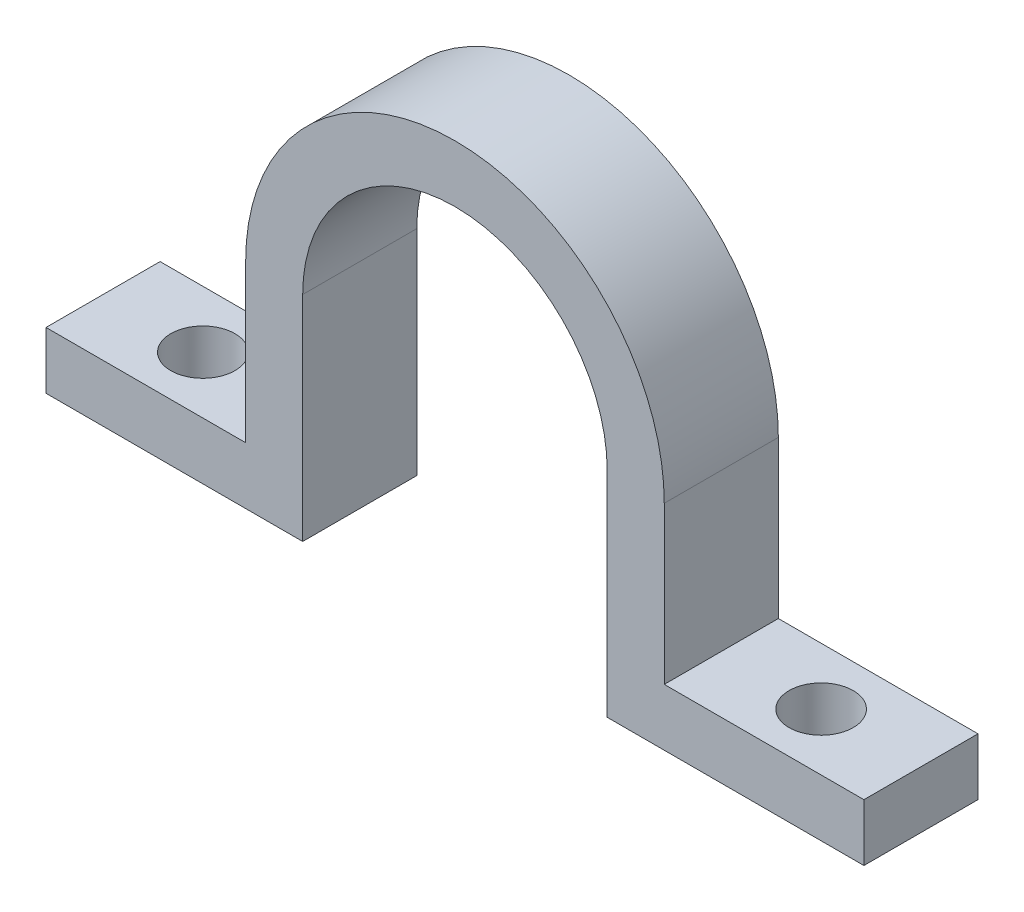
ISO-10303-21;
HEADER;
FILE_DESCRIPTION(('STEP AP214'),'2;1');
FILE_NAME('part.step','',(''),(''),'','','');
FILE_SCHEMA(('AUTOMOTIVE_DESIGN { 1 0 10303 214 1 1 1 1 }'));
ENDSEC;
DATA;
#1=APPLICATION_CONTEXT('core data for automotive mechanical design processes');
#2=APPLICATION_PROTOCOL_DEFINITION('international standard','automotive_design',2000,#1);
#3=PRODUCT_CONTEXT('',#1,'mechanical');
#4=PRODUCT('Part','Part','',(#3));
#5=PRODUCT_RELATED_PRODUCT_CATEGORY('part','',(#4));
#6=PRODUCT_DEFINITION_FORMATION('','',#4);
#7=PRODUCT_DEFINITION_CONTEXT('part definition',#1,'design');
#8=PRODUCT_DEFINITION('design','',#6,#7);
#9=PRODUCT_DEFINITION_SHAPE('','',#8);
#10=(LENGTH_UNIT() NAMED_UNIT(*) SI_UNIT(.MILLI.,.METRE.));
#11=(NAMED_UNIT(*) PLANE_ANGLE_UNIT() SI_UNIT($,.RADIAN.));
#12=(NAMED_UNIT(*) SI_UNIT($,.STERADIAN.) SOLID_ANGLE_UNIT());
#13=UNCERTAINTY_MEASURE_WITH_UNIT(LENGTH_MEASURE(1.E-05),#10,'distance_accuracy_value','');
#14=(GEOMETRIC_REPRESENTATION_CONTEXT(3) GLOBAL_UNCERTAINTY_ASSIGNED_CONTEXT((#13)) GLOBAL_UNIT_ASSIGNED_CONTEXT((#10,
#11,#12)) REPRESENTATION_CONTEXT('',''));
#15=CARTESIAN_POINT('',(0.,0.,0.));
#16=DIRECTION('',(0.,0.,1.));
#17=DIRECTION('',(1.,0.,0.));
#18=AXIS2_PLACEMENT_3D('',#15,#16,#17);
#19=CARTESIAN_POINT('',(-28.6775,4.,4.));
#20=DIRECTION('',(1.,0.,0.));
#21=DIRECTION('',(0.,0.,-1.));
#22=AXIS2_PLACEMENT_3D('',#19,#20,#21);
#23=PLANE('',#22);
#24=DIRECTION('',(0.,-1.,0.));
#25=VECTOR('',#24,1.);
#26=CARTESIAN_POINT('',(-28.6775,4.,-4.));
#27=LINE('',#26,#25);
#28=CARTESIAN_POINT('',(-28.6775,4.,-4.));
#29=VERTEX_POINT('',#28);
#30=CARTESIAN_POINT('',(-28.6775,0.,-4.));
#31=VERTEX_POINT('',#30);
#32=EDGE_CURVE('E164',#29,#31,#27,.T.);
#33=ORIENTED_EDGE('',*,*,#32,.T.);
#34=DIRECTION('',(0.,0.,-1.));
#35=VECTOR('',#34,1.);
#36=CARTESIAN_POINT('',(-28.6775,0.,4.));
#37=LINE('',#36,#35);
#38=CARTESIAN_POINT('',(-28.6775,0.,4.));
#39=VERTEX_POINT('',#38);
#40=EDGE_CURVE('E11',#39,#31,#37,.T.);
#41=ORIENTED_EDGE('',*,*,#40,.F.);
#42=DIRECTION('',(0.,-1.,0.));
#43=VECTOR('',#42,1.);
#44=CARTESIAN_POINT('',(-28.6775,4.,4.));
#45=LINE('',#44,#43);
#46=CARTESIAN_POINT('',(-28.6775,4.,4.));
#47=VERTEX_POINT('',#46);
#48=EDGE_CURVE('E189',#47,#39,#45,.T.);
#49=ORIENTED_EDGE('',*,*,#48,.F.);
#50=DIRECTION('',(0.,0.,-1.));
#51=VECTOR('',#50,1.);
#52=CARTESIAN_POINT('',(-28.6775,4.,4.));
#53=LINE('',#52,#51);
#54=EDGE_CURVE('E161',#47,#29,#53,.T.);
#55=ORIENTED_EDGE('',*,*,#54,.T.);
#56=EDGE_LOOP('',(#33,#41,#49,#55));
#57=FACE_BOUND('',#56,.T.);
#58=ADVANCED_FACE('F43',(#57),#23,.F.);
#59=CARTESIAN_POINT('',(-28.6775,0.,4.));
#60=DIRECTION('',(0.,1.,0.));
#61=DIRECTION('',(0.,0.,1.));
#62=AXIS2_PLACEMENT_3D('',#59,#60,#61);
#63=PLANE('',#62);
#64=CARTESIAN_POINT('',(-21.6775,0.,0.));
#65=DIRECTION('',(0.,1.,0.));
#66=DIRECTION('',(0.,0.,1.));
#67=AXIS2_PLACEMENT_3D('',#64,#65,#66);
#68=CIRCLE('',#67,2.25);
#69=CARTESIAN_POINT('',(-21.6775,0.,2.25));
#70=VERTEX_POINT('',#69);
#71=EDGE_CURVE('E213',#70,#70,#68,.F.);
#72=ORIENTED_EDGE('',*,*,#71,.F.);
#73=EDGE_LOOP('',(#72));
#74=FACE_BOUND('',#73,.T.);
#75=DIRECTION('',(1.,0.,0.));
#76=VECTOR('',#75,1.);
#77=CARTESIAN_POINT('',(-28.6775,0.,-4.));
#78=LINE('',#77,#76);
#79=CARTESIAN_POINT('',(-10.6775,0.,-4.));
#80=VERTEX_POINT('',#79);
#81=EDGE_CURVE('E169',#31,#80,#78,.T.);
#82=ORIENTED_EDGE('',*,*,#81,.T.);
#83=DIRECTION('',(0.,0.,-1.));
#84=VECTOR('',#83,1.);
#85=CARTESIAN_POINT('',(-10.6775,0.,4.));
#86=LINE('',#85,#84);
#87=CARTESIAN_POINT('',(-10.6775,0.,4.));
#88=VERTEX_POINT('',#87);
#89=EDGE_CURVE('E55',#88,#80,#86,.T.);
#90=ORIENTED_EDGE('',*,*,#89,.F.);
#91=DIRECTION('',(1.,0.,0.));
#92=VECTOR('',#91,1.);
#93=CARTESIAN_POINT('',(-28.6775,0.,4.));
#94=LINE('',#93,#92);
#95=EDGE_CURVE('E116',#39,#88,#94,.T.);
#96=ORIENTED_EDGE('',*,*,#95,.F.);
#97=ORIENTED_EDGE('',*,*,#40,.T.);
#98=EDGE_LOOP('',(#82,#90,#96,#97));
#99=FACE_BOUND('',#98,.T.);
#100=ADVANCED_FACE('F268',(#74,#99),#63,.F.);
#101=CARTESIAN_POINT('',(-10.6775,0.,4.));
#102=DIRECTION('',(-1.,0.,0.));
#103=DIRECTION('',(0.,0.,1.));
#104=AXIS2_PLACEMENT_3D('',#101,#102,#103);
#105=PLANE('',#104);
#106=DIRECTION('',(0.,1.,0.));
#107=VECTOR('',#106,1.);
#108=CARTESIAN_POINT('',(-10.6775,0.,-4.));
#109=LINE('',#108,#107);
#110=CARTESIAN_POINT('',(-10.6775,15.,-4.));
#111=VERTEX_POINT('',#110);
#112=EDGE_CURVE('E171',#80,#111,#109,.T.);
#113=ORIENTED_EDGE('',*,*,#112,.T.);
#114=DIRECTION('',(0.,0.,-1.));
#115=VECTOR('',#114,1.);
#116=CARTESIAN_POINT('',(-10.6775,15.,4.));
#117=LINE('',#116,#115);
#118=CARTESIAN_POINT('',(-10.6775,15.,4.));
#119=VERTEX_POINT('',#118);
#120=EDGE_CURVE('E210',#119,#111,#117,.T.);
#121=ORIENTED_EDGE('',*,*,#120,.F.);
#122=DIRECTION('',(0.,1.,0.));
#123=VECTOR('',#122,1.);
#124=CARTESIAN_POINT('',(-10.6775,0.,4.));
#125=LINE('',#124,#123);
#126=EDGE_CURVE('E226',#88,#119,#125,.T.);
#127=ORIENTED_EDGE('',*,*,#126,.F.);
#128=ORIENTED_EDGE('',*,*,#89,.T.);
#129=EDGE_LOOP('',(#113,#121,#127,#128));
#130=FACE_BOUND('',#129,.T.);
#131=ADVANCED_FACE('F272',(#130),#105,.F.);
#132=CARTESIAN_POINT('',(0.,15.,4.));
#133=DIRECTION('',(0.,0.,-1.));
#134=DIRECTION('',(-1.,0.,0.));
#135=AXIS2_PLACEMENT_3D('',#132,#133,#134);
#136=CYLINDRICAL_SURFACE('',#135,10.6775);
#137=CARTESIAN_POINT('',(0.,15.,-4.));
#138=DIRECTION('',(0.,0.,-1.));
#139=DIRECTION('',(-1.,0.,0.));
#140=AXIS2_PLACEMENT_3D('',#137,#138,#139);
#141=CIRCLE('',#140,10.6775);
#142=CARTESIAN_POINT('',(10.6775,15.,-4.));
#143=VERTEX_POINT('',#142);
#144=EDGE_CURVE('E174',#111,#143,#141,.T.);
#145=ORIENTED_EDGE('',*,*,#144,.T.);
#146=DIRECTION('',(0.,0.,-1.));
#147=VECTOR('',#146,1.);
#148=CARTESIAN_POINT('',(10.6775,15.,4.));
#149=LINE('',#148,#147);
#150=CARTESIAN_POINT('',(10.6775,15.,4.));
#151=VERTEX_POINT('',#150);
#152=EDGE_CURVE('E204',#151,#143,#149,.T.);
#153=ORIENTED_EDGE('',*,*,#152,.F.);
#154=CARTESIAN_POINT('',(0.,15.,4.));
#155=DIRECTION('',(0.,0.,-1.));
#156=DIRECTION('',(-1.,0.,0.));
#157=AXIS2_PLACEMENT_3D('',#154,#155,#156);
#158=CIRCLE('',#157,10.6775);
#159=EDGE_CURVE('E229',#119,#151,#158,.T.);
#160=ORIENTED_EDGE('',*,*,#159,.F.);
#161=ORIENTED_EDGE('',*,*,#120,.T.);
#162=EDGE_LOOP('',(#145,#153,#160,#161));
#163=FACE_BOUND('',#162,.T.);
#164=ADVANCED_FACE('F276',(#163),#136,.F.);
#165=CARTESIAN_POINT('',(10.6775,15.,4.));
#166=DIRECTION('',(1.,0.,0.));
#167=DIRECTION('',(0.,0.,-1.));
#168=AXIS2_PLACEMENT_3D('',#165,#166,#167);
#169=PLANE('',#168);
#170=DIRECTION('',(0.,-1.,0.));
#171=VECTOR('',#170,1.);
#172=CARTESIAN_POINT('',(10.6775,15.,-4.));
#173=LINE('',#172,#171);
#174=CARTESIAN_POINT('',(10.6775,0.,-4.));
#175=VERTEX_POINT('',#174);
#176=EDGE_CURVE('E175',#143,#175,#173,.T.);
#177=ORIENTED_EDGE('',*,*,#176,.T.);
#178=DIRECTION('',(0.,0.,-1.));
#179=VECTOR('',#178,1.);
#180=CARTESIAN_POINT('',(10.6775,0.,4.));
#181=LINE('',#180,#179);
#182=CARTESIAN_POINT('',(10.6775,0.,4.));
#183=VERTEX_POINT('',#182);
#184=EDGE_CURVE('E203',#183,#175,#181,.T.);
#185=ORIENTED_EDGE('',*,*,#184,.F.);
#186=DIRECTION('',(0.,-1.,0.));
#187=VECTOR('',#186,1.);
#188=CARTESIAN_POINT('',(10.6775,15.,4.));
#189=LINE('',#188,#187);
#190=EDGE_CURVE('E230',#151,#183,#189,.T.);
#191=ORIENTED_EDGE('',*,*,#190,.F.);
#192=ORIENTED_EDGE('',*,*,#152,.T.);
#193=EDGE_LOOP('',(#177,#185,#191,#192));
#194=FACE_BOUND('',#193,.T.);
#195=ADVANCED_FACE('F285',(#194),#169,.F.);
#196=CARTESIAN_POINT('',(10.6775,0.,4.));
#197=DIRECTION('',(0.,1.,0.));
#198=DIRECTION('',(0.,0.,1.));
#199=AXIS2_PLACEMENT_3D('',#196,#197,#198);
#200=PLANE('',#199);
#201=CARTESIAN_POINT('',(21.6775,0.,0.));
#202=DIRECTION('',(0.,1.,0.));
#203=DIRECTION('',(0.,0.,1.));
#204=AXIS2_PLACEMENT_3D('',#201,#202,#203);
#205=CIRCLE('',#204,2.25);
#206=CARTESIAN_POINT('',(21.6775,0.,2.25));
#207=VERTEX_POINT('',#206);
#208=EDGE_CURVE('E166',#207,#207,#205,.F.);
#209=ORIENTED_EDGE('',*,*,#208,.F.);
#210=EDGE_LOOP('',(#209));
#211=FACE_BOUND('',#210,.T.);
#212=DIRECTION('',(1.,0.,0.));
#213=VECTOR('',#212,1.);
#214=CARTESIAN_POINT('',(10.6775,0.,-4.));
#215=LINE('',#214,#213);
#216=CARTESIAN_POINT('',(28.6775,0.,-4.));
#217=VERTEX_POINT('',#216);
#218=EDGE_CURVE('E180',#175,#217,#215,.T.);
#219=ORIENTED_EDGE('',*,*,#218,.T.);
#220=DIRECTION('',(0.,0.,-1.));
#221=VECTOR('',#220,1.);
#222=CARTESIAN_POINT('',(28.6775,0.,4.));
#223=LINE('',#222,#221);
#224=CARTESIAN_POINT('',(28.6775,0.,4.));
#225=VERTEX_POINT('',#224);
#226=EDGE_CURVE('E196',#225,#217,#223,.T.);
#227=ORIENTED_EDGE('',*,*,#226,.F.);
#228=DIRECTION('',(1.,0.,0.));
#229=VECTOR('',#228,1.);
#230=CARTESIAN_POINT('',(10.6775,0.,4.));
#231=LINE('',#230,#229);
#232=EDGE_CURVE('E235',#183,#225,#231,.T.);
#233=ORIENTED_EDGE('',*,*,#232,.F.);
#234=ORIENTED_EDGE('',*,*,#184,.T.);
#235=EDGE_LOOP('',(#219,#227,#233,#234));
#236=FACE_BOUND('',#235,.T.);
#237=ADVANCED_FACE('F289',(#211,#236),#200,.F.);
#238=CARTESIAN_POINT('',(28.6775,0.,4.));
#239=DIRECTION('',(-1.,0.,0.));
#240=DIRECTION('',(0.,0.,1.));
#241=AXIS2_PLACEMENT_3D('',#238,#239,#240);
#242=PLANE('',#241);
#243=DIRECTION('',(0.,1.,0.));
#244=VECTOR('',#243,1.);
#245=CARTESIAN_POINT('',(28.6775,0.,-4.));
#246=LINE('',#245,#244);
#247=CARTESIAN_POINT('',(28.6775,4.,-4.));
#248=VERTEX_POINT('',#247);
#249=EDGE_CURVE('E179',#217,#248,#246,.T.);
#250=ORIENTED_EDGE('',*,*,#249,.T.);
#251=DIRECTION('',(0.,0.,-1.));
#252=VECTOR('',#251,1.);
#253=CARTESIAN_POINT('',(28.6775,4.,4.));
#254=LINE('',#253,#252);
#255=CARTESIAN_POINT('',(28.6775,4.,4.));
#256=VERTEX_POINT('',#255);
#257=EDGE_CURVE('E192',#256,#248,#254,.T.);
#258=ORIENTED_EDGE('',*,*,#257,.F.);
#259=DIRECTION('',(0.,1.,0.));
#260=VECTOR('',#259,1.);
#261=CARTESIAN_POINT('',(28.6775,0.,4.));
#262=LINE('',#261,#260);
#263=EDGE_CURVE('E234',#225,#256,#262,.T.);
#264=ORIENTED_EDGE('',*,*,#263,.F.);
#265=ORIENTED_EDGE('',*,*,#226,.T.);
#266=EDGE_LOOP('',(#250,#258,#264,#265));
#267=FACE_BOUND('',#266,.T.);
#268=ADVANCED_FACE('F295',(#267),#242,.F.);
#269=CARTESIAN_POINT('',(28.6775,4.,4.));
#270=DIRECTION('',(0.,-1.,0.));
#271=DIRECTION('',(0.,0.,-1.));
#272=AXIS2_PLACEMENT_3D('',#269,#270,#271);
#273=PLANE('',#272);
#274=CARTESIAN_POINT('',(21.6775,4.,0.));
#275=DIRECTION('',(0.,-1.,0.));
#276=DIRECTION('',(0.,0.,-1.));
#277=AXIS2_PLACEMENT_3D('',#274,#275,#276);
#278=CIRCLE('',#277,2.25);
#279=CARTESIAN_POINT('',(21.6775,4.,-2.25));
#280=VERTEX_POINT('',#279);
#281=EDGE_CURVE('E46',#280,#280,#278,.F.);
#282=ORIENTED_EDGE('',*,*,#281,.F.);
#283=EDGE_LOOP('',(#282));
#284=FACE_BOUND('',#283,.T.);
#285=DIRECTION('',(-1.,0.,0.));
#286=VECTOR('',#285,1.);
#287=CARTESIAN_POINT('',(28.6775,4.,-4.));
#288=LINE('',#287,#286);
#289=CARTESIAN_POINT('',(14.6775,4.,-4.));
#290=VERTEX_POINT('',#289);
#291=EDGE_CURVE('E182',#248,#290,#288,.T.);
#292=ORIENTED_EDGE('',*,*,#291,.T.);
#293=DIRECTION('',(0.,0.,-1.));
#294=VECTOR('',#293,1.);
#295=CARTESIAN_POINT('',(14.6775,4.,4.));
#296=LINE('',#295,#294);
#297=CARTESIAN_POINT('',(14.6775,4.,4.));
#298=VERTEX_POINT('',#297);
#299=EDGE_CURVE('E195',#298,#290,#296,.T.);
#300=ORIENTED_EDGE('',*,*,#299,.F.);
#301=DIRECTION('',(-1.,0.,0.));
#302=VECTOR('',#301,1.);
#303=CARTESIAN_POINT('',(28.6775,4.,4.));
#304=LINE('',#303,#302);
#305=EDGE_CURVE('E237',#256,#298,#304,.T.);
#306=ORIENTED_EDGE('',*,*,#305,.F.);
#307=ORIENTED_EDGE('',*,*,#257,.T.);
#308=EDGE_LOOP('',(#292,#300,#306,#307));
#309=FACE_BOUND('',#308,.T.);
#310=ADVANCED_FACE('F242',(#284,#309),#273,.F.);
#311=CARTESIAN_POINT('',(14.6775,4.,4.));
#312=DIRECTION('',(-1.,0.,0.));
#313=DIRECTION('',(0.,0.,1.));
#314=AXIS2_PLACEMENT_3D('',#311,#312,#313);
#315=PLANE('',#314);
#316=DIRECTION('',(0.,1.,0.));
#317=VECTOR('',#316,1.);
#318=CARTESIAN_POINT('',(14.6775,4.,-4.));
#319=LINE('',#318,#317);
#320=CARTESIAN_POINT('',(14.6775,15.,-4.));
#321=VERTEX_POINT('',#320);
#322=EDGE_CURVE('E181',#290,#321,#319,.T.);
#323=ORIENTED_EDGE('',*,*,#322,.T.);
#324=DIRECTION('',(0.,0.,-1.));
#325=VECTOR('',#324,1.);
#326=CARTESIAN_POINT('',(14.6775,15.,4.));
#327=LINE('',#326,#325);
#328=CARTESIAN_POINT('',(14.6775,15.,4.));
#329=VERTEX_POINT('',#328);
#330=EDGE_CURVE('E156',#329,#321,#327,.T.);
#331=ORIENTED_EDGE('',*,*,#330,.F.);
#332=DIRECTION('',(0.,1.,0.));
#333=VECTOR('',#332,1.);
#334=CARTESIAN_POINT('',(14.6775,4.,4.));
#335=LINE('',#334,#333);
#336=EDGE_CURVE('E150',#298,#329,#335,.T.);
#337=ORIENTED_EDGE('',*,*,#336,.F.);
#338=ORIENTED_EDGE('',*,*,#299,.T.);
#339=EDGE_LOOP('',(#323,#331,#337,#338));
#340=FACE_BOUND('',#339,.T.);
#341=ADVANCED_FACE('F248',(#340),#315,.F.);
#342=CARTESIAN_POINT('',(0.,15.,4.));
#343=DIRECTION('',(0.,0.,-1.));
#344=DIRECTION('',(-1.,0.,0.));
#345=AXIS2_PLACEMENT_3D('',#342,#343,#344);
#346=CYLINDRICAL_SURFACE('',#345,14.6775);
#347=CARTESIAN_POINT('',(0.,15.,-4.));
#348=DIRECTION('',(0.,0.,1.));
#349=DIRECTION('',(1.,0.,0.));
#350=AXIS2_PLACEMENT_3D('',#347,#348,#349);
#351=CIRCLE('',#350,14.6775);
#352=CARTESIAN_POINT('',(-14.6775,15.,-4.));
#353=VERTEX_POINT('',#352);
#354=EDGE_CURVE('E154',#321,#353,#351,.T.);
#355=ORIENTED_EDGE('',*,*,#354,.T.);
#356=DIRECTION('',(0.,0.,-1.));
#357=VECTOR('',#356,1.);
#358=CARTESIAN_POINT('',(-14.6775,15.,4.));
#359=LINE('',#358,#357);
#360=CARTESIAN_POINT('',(-14.6775,15.,4.));
#361=VERTEX_POINT('',#360);
#362=EDGE_CURVE('E155',#361,#353,#359,.T.);
#363=ORIENTED_EDGE('',*,*,#362,.F.);
#364=CARTESIAN_POINT('',(0.,15.,4.));
#365=DIRECTION('',(0.,0.,1.));
#366=DIRECTION('',(1.,0.,0.));
#367=AXIS2_PLACEMENT_3D('',#364,#365,#366);
#368=CIRCLE('',#367,14.6775);
#369=EDGE_CURVE('E143',#329,#361,#368,.T.);
#370=ORIENTED_EDGE('',*,*,#369,.F.);
#371=ORIENTED_EDGE('',*,*,#330,.T.);
#372=EDGE_LOOP('',(#355,#363,#370,#371));
#373=FACE_BOUND('',#372,.T.);
#374=ADVANCED_FACE('F153',(#373),#346,.T.);
#375=CARTESIAN_POINT('',(-14.6775,15.,4.));
#376=DIRECTION('',(1.,0.,0.));
#377=DIRECTION('',(0.,0.,-1.));
#378=AXIS2_PLACEMENT_3D('',#375,#376,#377);
#379=PLANE('',#378);
#380=DIRECTION('',(0.,-1.,0.));
#381=VECTOR('',#380,1.);
#382=CARTESIAN_POINT('',(-14.6775,15.,-4.));
#383=LINE('',#382,#381);
#384=CARTESIAN_POINT('',(-14.6775,4.,-4.));
#385=VERTEX_POINT('',#384);
#386=EDGE_CURVE('E105',#353,#385,#383,.T.);
#387=ORIENTED_EDGE('',*,*,#386,.T.);
#388=DIRECTION('',(0.,0.,-1.));
#389=VECTOR('',#388,1.);
#390=CARTESIAN_POINT('',(-14.6775,4.,4.));
#391=LINE('',#390,#389);
#392=CARTESIAN_POINT('',(-14.6775,4.,4.));
#393=VERTEX_POINT('',#392);
#394=EDGE_CURVE('E160',#393,#385,#391,.T.);
#395=ORIENTED_EDGE('',*,*,#394,.F.);
#396=DIRECTION('',(0.,-1.,0.));
#397=VECTOR('',#396,1.);
#398=CARTESIAN_POINT('',(-14.6775,15.,4.));
#399=LINE('',#398,#397);
#400=EDGE_CURVE('E144',#361,#393,#399,.T.);
#401=ORIENTED_EDGE('',*,*,#400,.F.);
#402=ORIENTED_EDGE('',*,*,#362,.T.);
#403=EDGE_LOOP('',(#387,#395,#401,#402));
#404=FACE_BOUND('',#403,.T.);
#405=ADVANCED_FACE('F157',(#404),#379,.F.);
#406=CARTESIAN_POINT('',(-14.6775,4.,4.));
#407=DIRECTION('',(0.,-1.,0.));
#408=DIRECTION('',(0.,0.,-1.));
#409=AXIS2_PLACEMENT_3D('',#406,#407,#408);
#410=PLANE('',#409);
#411=CARTESIAN_POINT('',(-21.6775,4.,0.));
#412=DIRECTION('',(0.,-1.,0.));
#413=DIRECTION('',(0.,0.,-1.));
#414=AXIS2_PLACEMENT_3D('',#411,#412,#413);
#415=CIRCLE('',#414,2.25);
#416=CARTESIAN_POINT('',(-21.6775,4.,-2.25));
#417=VERTEX_POINT('',#416);
#418=EDGE_CURVE('E211',#417,#417,#415,.F.);
#419=ORIENTED_EDGE('',*,*,#418,.F.);
#420=EDGE_LOOP('',(#419));
#421=FACE_BOUND('',#420,.T.);
#422=DIRECTION('',(-1.,0.,0.));
#423=VECTOR('',#422,1.);
#424=CARTESIAN_POINT('',(-14.6775,4.,-4.));
#425=LINE('',#424,#423);
#426=EDGE_CURVE('E107',#385,#29,#425,.T.);
#427=ORIENTED_EDGE('',*,*,#426,.T.);
#428=ORIENTED_EDGE('',*,*,#54,.F.);
#429=DIRECTION('',(-1.,0.,0.));
#430=VECTOR('',#429,1.);
#431=CARTESIAN_POINT('',(-14.6775,4.,4.));
#432=LINE('',#431,#430);
#433=EDGE_CURVE('E61',#393,#47,#432,.T.);
#434=ORIENTED_EDGE('',*,*,#433,.F.);
#435=ORIENTED_EDGE('',*,*,#394,.T.);
#436=EDGE_LOOP('',(#427,#428,#434,#435));
#437=FACE_BOUND('',#436,.T.);
#438=ADVANCED_FACE('F255',(#421,#437),#410,.F.);
#439=CARTESIAN_POINT('',(0.,15.,4.));
#440=DIRECTION('',(0.,0.,-1.));
#441=DIRECTION('',(-1.,0.,0.));
#442=AXIS2_PLACEMENT_3D('',#439,#440,#441);
#443=PLANE('',#442);
#444=ORIENTED_EDGE('',*,*,#48,.T.);
#445=ORIENTED_EDGE('',*,*,#95,.T.);
#446=ORIENTED_EDGE('',*,*,#126,.T.);
#447=ORIENTED_EDGE('',*,*,#159,.T.);
#448=ORIENTED_EDGE('',*,*,#190,.T.);
#449=ORIENTED_EDGE('',*,*,#232,.T.);
#450=ORIENTED_EDGE('',*,*,#263,.T.);
#451=ORIENTED_EDGE('',*,*,#305,.T.);
#452=ORIENTED_EDGE('',*,*,#336,.T.);
#453=ORIENTED_EDGE('',*,*,#369,.T.);
#454=ORIENTED_EDGE('',*,*,#400,.T.);
#455=ORIENTED_EDGE('',*,*,#433,.T.);
#456=EDGE_LOOP('',(#444,#445,#446,#447,#448,#449,#450,#451,#452,#453,#454,#455));
#457=FACE_BOUND('',#456,.T.);
#458=ADVANCED_FACE('F141',(#457),#443,.F.);
#459=CARTESIAN_POINT('',(0.,15.,-4.));
#460=DIRECTION('',(0.,0.,-1.));
#461=DIRECTION('',(-1.,0.,0.));
#462=AXIS2_PLACEMENT_3D('',#459,#460,#461);
#463=PLANE('',#462);
#464=ORIENTED_EDGE('',*,*,#32,.F.);
#465=ORIENTED_EDGE('',*,*,#426,.F.);
#466=ORIENTED_EDGE('',*,*,#386,.F.);
#467=ORIENTED_EDGE('',*,*,#354,.F.);
#468=ORIENTED_EDGE('',*,*,#322,.F.);
#469=ORIENTED_EDGE('',*,*,#291,.F.);
#470=ORIENTED_EDGE('',*,*,#249,.F.);
#471=ORIENTED_EDGE('',*,*,#218,.F.);
#472=ORIENTED_EDGE('',*,*,#176,.F.);
#473=ORIENTED_EDGE('',*,*,#144,.F.);
#474=ORIENTED_EDGE('',*,*,#112,.F.);
#475=ORIENTED_EDGE('',*,*,#81,.F.);
#476=EDGE_LOOP('',(#464,#465,#466,#467,#468,#469,#470,#471,#472,#473,#474,#475));
#477=FACE_BOUND('',#476,.T.);
#478=ADVANCED_FACE('F249',(#477),#463,.T.);
#479=CARTESIAN_POINT('',(-21.6775,4.5,0.));
#480=DIRECTION('',(0.,-1.,0.));
#481=DIRECTION('',(0.,0.,-1.));
#482=AXIS2_PLACEMENT_3D('',#479,#480,#481);
#483=CYLINDRICAL_SURFACE('',#482,2.25);
#484=ORIENTED_EDGE('',*,*,#418,.T.);
#485=EDGE_LOOP('',(#484));
#486=FACE_BOUND('',#485,.T.);
#487=ORIENTED_EDGE('',*,*,#71,.T.);
#488=EDGE_LOOP('',(#487));
#489=FACE_BOUND('',#488,.T.);
#490=ADVANCED_FACE('F321',(#486,#489),#483,.F.);
#491=CARTESIAN_POINT('',(21.6775,4.5,0.));
#492=DIRECTION('',(0.,-1.,0.));
#493=DIRECTION('',(0.,0.,-1.));
#494=AXIS2_PLACEMENT_3D('',#491,#492,#493);
#495=CYLINDRICAL_SURFACE('',#494,2.25);
#496=ORIENTED_EDGE('',*,*,#281,.T.);
#497=EDGE_LOOP('',(#496));
#498=FACE_BOUND('',#497,.T.);
#499=ORIENTED_EDGE('',*,*,#208,.T.);
#500=EDGE_LOOP('',(#499));
#501=FACE_BOUND('',#500,.T.);
#502=ADVANCED_FACE('F332',(#498,#501),#495,.F.);
#503=CLOSED_SHELL('',(#58,#100,#131,#164,#195,#237,#268,#310,#341,#374,#405,#438,#458,#478,#490,#502));
#504=MANIFOLD_SOLID_BREP('B2',#503);
#505=ADVANCED_BREP_SHAPE_REPRESENTATION('',(#18,#504),#14);
#506=SHAPE_DEFINITION_REPRESENTATION(#9,#505);
ENDSEC;
END-ISO-10303-21;
